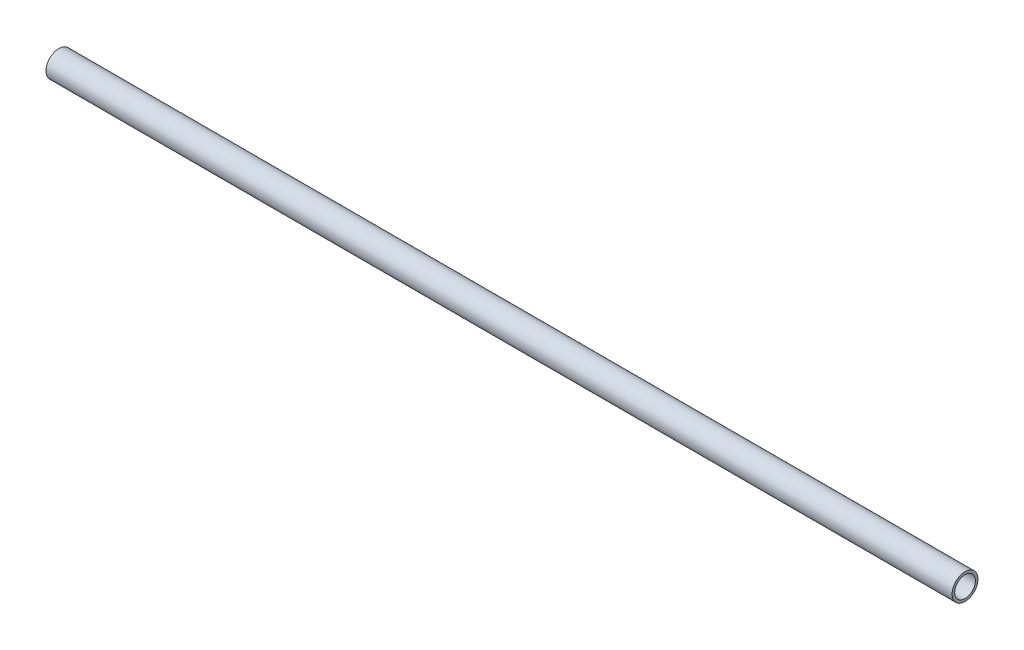
ISO-10303-21;
HEADER;
FILE_DESCRIPTION(('STEP AP214'),'2;1');
FILE_NAME('part.step','',(''),(''),'','','');
FILE_SCHEMA(('AUTOMOTIVE_DESIGN { 1 0 10303 214 1 1 1 1 }'));
ENDSEC;
DATA;
#1=APPLICATION_CONTEXT('core data for automotive mechanical design processes');
#2=APPLICATION_PROTOCOL_DEFINITION('international standard','automotive_design',2000,#1);
#3=PRODUCT_CONTEXT('',#1,'mechanical');
#4=PRODUCT('Part','Part','',(#3));
#5=PRODUCT_RELATED_PRODUCT_CATEGORY('part','',(#4));
#6=PRODUCT_DEFINITION_FORMATION('','',#4);
#7=PRODUCT_DEFINITION_CONTEXT('part definition',#1,'design');
#8=PRODUCT_DEFINITION('design','',#6,#7);
#9=PRODUCT_DEFINITION_SHAPE('','',#8);
#10=(LENGTH_UNIT() NAMED_UNIT(*) SI_UNIT(.MILLI.,.METRE.));
#11=(NAMED_UNIT(*) PLANE_ANGLE_UNIT() SI_UNIT($,.RADIAN.));
#12=(NAMED_UNIT(*) SI_UNIT($,.STERADIAN.) SOLID_ANGLE_UNIT());
#13=UNCERTAINTY_MEASURE_WITH_UNIT(LENGTH_MEASURE(1.E-05),#10,'distance_accuracy_value','');
#14=(GEOMETRIC_REPRESENTATION_CONTEXT(3) GLOBAL_UNCERTAINTY_ASSIGNED_CONTEXT((#13)) GLOBAL_UNIT_ASSIGNED_CONTEXT((#10,
#11,#12)) REPRESENTATION_CONTEXT('',''));
#15=CARTESIAN_POINT('',(0.,0.,0.));
#16=DIRECTION('',(0.,0.,1.));
#17=DIRECTION('',(1.,0.,0.));
#18=AXIS2_PLACEMENT_3D('',#15,#16,#17);
#19=CARTESIAN_POINT('',(350.,0.,0.));
#20=DIRECTION('',(1.,0.,0.));
#21=DIRECTION('',(0.,0.,-1.));
#22=AXIS2_PLACEMENT_3D('',#19,#20,#21);
#23=PLANE('',#22);
#24=CARTESIAN_POINT('',(350.,0.,0.));
#25=DIRECTION('',(1.,0.,0.));
#26=DIRECTION('',(0.,0.,-1.));
#27=AXIS2_PLACEMENT_3D('',#24,#25,#26);
#28=CIRCLE('',#27,5.);
#29=CARTESIAN_POINT('',(350.,0.,-5.));
#30=VERTEX_POINT('',#29);
#31=EDGE_CURVE('E10',#30,#30,#28,.T.);
#32=ORIENTED_EDGE('',*,*,#31,.T.);
#33=EDGE_LOOP('',(#32));
#34=FACE_BOUND('',#33,.T.);
#35=CARTESIAN_POINT('',(350.,0.,0.));
#36=DIRECTION('',(1.,0.,0.));
#37=DIRECTION('',(0.,0.,-1.));
#38=AXIS2_PLACEMENT_3D('',#35,#36,#37);
#39=CIRCLE('',#38,4.);
#40=CARTESIAN_POINT('',(350.,0.,-4.));
#41=VERTEX_POINT('',#40);
#42=EDGE_CURVE('E42',#41,#41,#39,.T.);
#43=ORIENTED_EDGE('',*,*,#42,.F.);
#44=EDGE_LOOP('',(#43));
#45=FACE_BOUND('',#44,.T.);
#46=ADVANCED_FACE('F31',(#34,#45),#23,.T.);
#47=CARTESIAN_POINT('',(0.,0.,0.));
#48=DIRECTION('',(1.,0.,0.));
#49=DIRECTION('',(0.,0.,-1.));
#50=AXIS2_PLACEMENT_3D('',#47,#48,#49);
#51=PLANE('',#50);
#52=CARTESIAN_POINT('',(0.,0.,0.));
#53=DIRECTION('',(1.,0.,0.));
#54=DIRECTION('',(0.,0.,-1.));
#55=AXIS2_PLACEMENT_3D('',#52,#53,#54);
#56=CIRCLE('',#55,5.);
#57=CARTESIAN_POINT('',(0.,0.,-5.));
#58=VERTEX_POINT('',#57);
#59=EDGE_CURVE('E35',#58,#58,#56,.T.);
#60=ORIENTED_EDGE('',*,*,#59,.F.);
#61=EDGE_LOOP('',(#60));
#62=FACE_BOUND('',#61,.T.);
#63=CARTESIAN_POINT('',(0.,0.,0.));
#64=DIRECTION('',(1.,0.,0.));
#65=DIRECTION('',(0.,0.,-1.));
#66=AXIS2_PLACEMENT_3D('',#63,#64,#65);
#67=CIRCLE('',#66,4.);
#68=CARTESIAN_POINT('',(0.,0.,-4.));
#69=VERTEX_POINT('',#68);
#70=EDGE_CURVE('E44',#69,#69,#67,.T.);
#71=ORIENTED_EDGE('',*,*,#70,.T.);
#72=EDGE_LOOP('',(#71));
#73=FACE_BOUND('',#72,.T.);
#74=ADVANCED_FACE('F54',(#62,#73),#51,.F.);
#75=CARTESIAN_POINT('',(350.,0.,0.));
#76=DIRECTION('',(-1.,0.,0.));
#77=DIRECTION('',(0.,0.,1.));
#78=AXIS2_PLACEMENT_3D('',#75,#76,#77);
#79=CYLINDRICAL_SURFACE('',#78,5.);
#80=ORIENTED_EDGE('',*,*,#31,.F.);
#81=EDGE_LOOP('',(#80));
#82=FACE_BOUND('',#81,.T.);
#83=ORIENTED_EDGE('',*,*,#59,.T.);
#84=EDGE_LOOP('',(#83));
#85=FACE_BOUND('',#84,.T.);
#86=ADVANCED_FACE('F33',(#82,#85),#79,.T.);
#87=CARTESIAN_POINT('',(350.,0.,0.));
#88=DIRECTION('',(-1.,0.,0.));
#89=DIRECTION('',(0.,0.,1.));
#90=AXIS2_PLACEMENT_3D('',#87,#88,#89);
#91=CYLINDRICAL_SURFACE('',#90,4.);
#92=ORIENTED_EDGE('',*,*,#42,.T.);
#93=EDGE_LOOP('',(#92));
#94=FACE_BOUND('',#93,.T.);
#95=ORIENTED_EDGE('',*,*,#70,.F.);
#96=EDGE_LOOP('',(#95));
#97=FACE_BOUND('',#96,.T.);
#98=ADVANCED_FACE('F50',(#94,#97),#91,.F.);
#99=CLOSED_SHELL('',(#46,#74,#86,#98));
#100=MANIFOLD_SOLID_BREP('B2',#99);
#101=ADVANCED_BREP_SHAPE_REPRESENTATION('',(#18,#100),#14);
#102=SHAPE_DEFINITION_REPRESENTATION(#9,#101);
ENDSEC;
END-ISO-10303-21;
